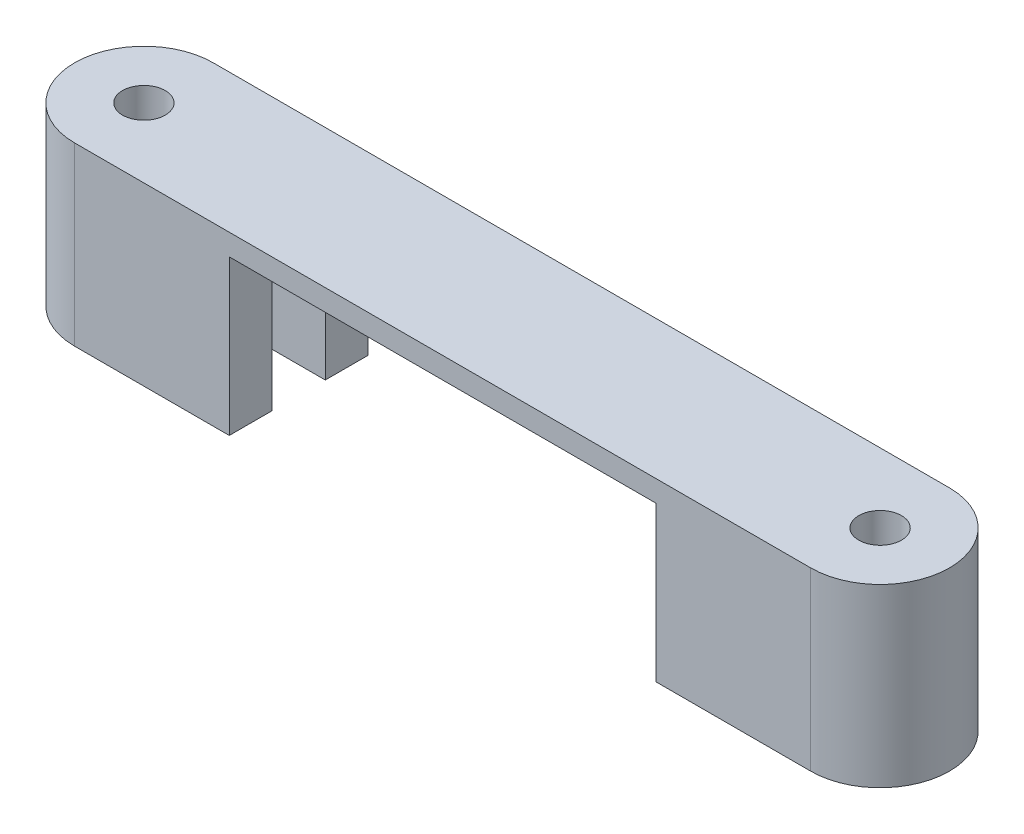
ISO-10303-21;
HEADER;
FILE_DESCRIPTION(('STEP AP214'),'2;1');
FILE_NAME('part.step','',(''),(''),'','','');
FILE_SCHEMA(('AUTOMOTIVE_DESIGN { 1 0 10303 214 1 1 1 1 }'));
ENDSEC;
DATA;
#1=APPLICATION_CONTEXT('core data for automotive mechanical design processes');
#2=APPLICATION_PROTOCOL_DEFINITION('international standard','automotive_design',2000,#1);
#3=PRODUCT_CONTEXT('',#1,'mechanical');
#4=PRODUCT('Part','Part','',(#3));
#5=PRODUCT_RELATED_PRODUCT_CATEGORY('part','',(#4));
#6=PRODUCT_DEFINITION_FORMATION('','',#4);
#7=PRODUCT_DEFINITION_CONTEXT('part definition',#1,'design');
#8=PRODUCT_DEFINITION('design','',#6,#7);
#9=PRODUCT_DEFINITION_SHAPE('','',#8);
#10=(LENGTH_UNIT() NAMED_UNIT(*) SI_UNIT(.MILLI.,.METRE.));
#11=(NAMED_UNIT(*) PLANE_ANGLE_UNIT() SI_UNIT($,.RADIAN.));
#12=(NAMED_UNIT(*) SI_UNIT($,.STERADIAN.) SOLID_ANGLE_UNIT());
#13=UNCERTAINTY_MEASURE_WITH_UNIT(LENGTH_MEASURE(1.E-05),#10,'distance_accuracy_value','');
#14=(GEOMETRIC_REPRESENTATION_CONTEXT(3) GLOBAL_UNCERTAINTY_ASSIGNED_CONTEXT((#13)) GLOBAL_UNIT_ASSIGNED_CONTEXT((#10,
#11,#12)) REPRESENTATION_CONTEXT('',''));
#15=CARTESIAN_POINT('',(0.,0.,0.));
#16=DIRECTION('',(0.,0.,1.));
#17=DIRECTION('',(1.,0.,0.));
#18=AXIS2_PLACEMENT_3D('',#15,#16,#17);
#19=CARTESIAN_POINT('',(0.,0.,-6.5));
#20=DIRECTION('',(0.,1.,0.));
#21=DIRECTION('',(0.,0.,1.));
#22=AXIS2_PLACEMENT_3D('',#19,#20,#21);
#23=PLANE('',#22);
#24=CARTESIAN_POINT('',(0.,0.,-6.5));
#25=DIRECTION('',(0.,1.,0.));
#26=DIRECTION('',(0.,0.,1.));
#27=AXIS2_PLACEMENT_3D('',#24,#25,#26);
#28=CIRCLE('',#27,2.);
#29=CARTESIAN_POINT('',(0.,0.,-4.5));
#30=VERTEX_POINT('',#29);
#31=EDGE_CURVE('E193',#30,#30,#28,.T.);
#32=ORIENTED_EDGE('',*,*,#31,.T.);
#33=EDGE_LOOP('',(#32));
#34=FACE_BOUND('',#33,.T.);
#35=DIRECTION('',(-1.,0.,0.));
#36=VECTOR('',#35,1.);
#37=CARTESIAN_POINT('',(69.,0.,-13.));
#38=LINE('',#37,#36);
#39=CARTESIAN_POINT('',(14.5,0.,-13.));
#40=VERTEX_POINT('',#39);
#41=CARTESIAN_POINT('',(0.,0.,-13.));
#42=VERTEX_POINT('',#41);
#43=EDGE_CURVE('E80',#40,#42,#38,.T.);
#44=ORIENTED_EDGE('',*,*,#43,.F.);
#45=DIRECTION('',(0.,0.,-1.));
#46=VECTOR('',#45,1.);
#47=CARTESIAN_POINT('',(14.5,0.,-8.99999999999999));
#48=LINE('',#47,#46);
#49=CARTESIAN_POINT('',(14.5,0.,-8.99999999999999));
#50=VERTEX_POINT('',#49);
#51=EDGE_CURVE('E172',#50,#40,#48,.T.);
#52=ORIENTED_EDGE('',*,*,#51,.F.);
#53=DIRECTION('',(1.,0.,0.));
#54=VECTOR('',#53,1.);
#55=CARTESIAN_POINT('',(6.49999999999999,0.,-8.99999999999999));
#56=LINE('',#55,#54);
#57=CARTESIAN_POINT('',(6.49999999999999,0.,-8.99999999999999));
#58=VERTEX_POINT('',#57);
#59=EDGE_CURVE('E275',#58,#50,#56,.T.);
#60=ORIENTED_EDGE('',*,*,#59,.F.);
#61=DIRECTION('',(0.,0.,-1.));
#62=VECTOR('',#61,1.);
#63=CARTESIAN_POINT('',(6.49999999999999,0.,-3.99999999999999));
#64=LINE('',#63,#62);
#65=CARTESIAN_POINT('',(6.49999999999999,0.,-3.99999999999999));
#66=VERTEX_POINT('',#65);
#67=EDGE_CURVE('E267',#66,#58,#64,.T.);
#68=ORIENTED_EDGE('',*,*,#67,.F.);
#69=DIRECTION('',(-1.,0.,0.));
#70=VECTOR('',#69,1.);
#71=CARTESIAN_POINT('',(14.5,0.,-3.99999999999999));
#72=LINE('',#71,#70);
#73=CARTESIAN_POINT('',(14.5,0.,-3.99999999999999));
#74=VERTEX_POINT('',#73);
#75=EDGE_CURVE('E263',#74,#66,#72,.T.);
#76=ORIENTED_EDGE('',*,*,#75,.F.);
#77=DIRECTION('',(0.,0.,-1.));
#78=VECTOR('',#77,1.);
#79=CARTESIAN_POINT('',(14.5,0.,0.));
#80=LINE('',#79,#78);
#81=CARTESIAN_POINT('',(14.5,0.,0.));
#82=VERTEX_POINT('',#81);
#83=EDGE_CURVE('E260',#82,#74,#80,.T.);
#84=ORIENTED_EDGE('',*,*,#83,.F.);
#85=DIRECTION('',(1.,0.,0.));
#86=VECTOR('',#85,1.);
#87=CARTESIAN_POINT('',(0.,0.,0.));
#88=LINE('',#87,#86);
#89=CARTESIAN_POINT('',(0.,0.,0.));
#90=VERTEX_POINT('',#89);
#91=EDGE_CURVE('E205',#90,#82,#88,.T.);
#92=ORIENTED_EDGE('',*,*,#91,.F.);
#93=CARTESIAN_POINT('',(0.,0.,-6.5));
#94=DIRECTION('',(0.,1.,0.));
#95=DIRECTION('',(0.,0.,1.));
#96=AXIS2_PLACEMENT_3D('',#93,#94,#95);
#97=CIRCLE('',#96,6.5);
#98=EDGE_CURVE('E201',#42,#90,#97,.T.);
#99=ORIENTED_EDGE('',*,*,#98,.F.);
#100=EDGE_LOOP('',(#44,#52,#60,#68,#76,#84,#92,#99));
#101=FACE_BOUND('',#100,.T.);
#102=ADVANCED_FACE('F33',(#34,#101),#23,.F.);
#103=CARTESIAN_POINT('',(0.,16.5,-6.5));
#104=DIRECTION('',(0.,-1.,0.));
#105=DIRECTION('',(0.,0.,-1.));
#106=AXIS2_PLACEMENT_3D('',#103,#104,#105);
#107=CYLINDRICAL_SURFACE('',#106,6.5);
#108=ORIENTED_EDGE('',*,*,#98,.T.);
#109=DIRECTION('',(0.,-1.,0.));
#110=VECTOR('',#109,1.);
#111=CARTESIAN_POINT('',(0.,16.5,0.));
#112=LINE('',#111,#110);
#113=CARTESIAN_POINT('',(0.,16.5,0.));
#114=VERTEX_POINT('',#113);
#115=EDGE_CURVE('E11',#114,#90,#112,.T.);
#116=ORIENTED_EDGE('',*,*,#115,.F.);
#117=CARTESIAN_POINT('',(0.,16.5,-6.5));
#118=DIRECTION('',(0.,1.,0.));
#119=DIRECTION('',(0.,0.,1.));
#120=AXIS2_PLACEMENT_3D('',#117,#118,#119);
#121=CIRCLE('',#120,6.5);
#122=CARTESIAN_POINT('',(0.,16.5,-13.));
#123=VERTEX_POINT('',#122);
#124=EDGE_CURVE('E194',#123,#114,#121,.T.);
#125=ORIENTED_EDGE('',*,*,#124,.F.);
#126=DIRECTION('',(0.,-1.,0.));
#127=VECTOR('',#126,1.);
#128=CARTESIAN_POINT('',(0.,16.5,-13.));
#129=LINE('',#128,#127);
#130=EDGE_CURVE('E200',#123,#42,#129,.T.);
#131=ORIENTED_EDGE('',*,*,#130,.T.);
#132=EDGE_LOOP('',(#108,#116,#125,#131));
#133=FACE_BOUND('',#132,.T.);
#134=ADVANCED_FACE('F35',(#133),#107,.T.);
#135=CARTESIAN_POINT('',(0.,16.5,0.));
#136=DIRECTION('',(0.,0.,-1.));
#137=DIRECTION('',(-1.,0.,0.));
#138=AXIS2_PLACEMENT_3D('',#135,#136,#137);
#139=PLANE('',#138);
#140=ORIENTED_EDGE('',*,*,#91,.T.);
#141=DIRECTION('',(0.,-1.,0.));
#142=VECTOR('',#141,1.);
#143=CARTESIAN_POINT('',(14.5,14.5,0.));
#144=LINE('',#143,#142);
#145=CARTESIAN_POINT('',(14.5,14.5,0.));
#146=VERTEX_POINT('',#145);
#147=EDGE_CURVE('E254',#146,#82,#144,.T.);
#148=ORIENTED_EDGE('',*,*,#147,.F.);
#149=DIRECTION('',(-1.,0.,0.));
#150=VECTOR('',#149,1.);
#151=CARTESIAN_POINT('',(54.5,14.5,0.));
#152=LINE('',#151,#150);
#153=CARTESIAN_POINT('',(54.5,14.5,0.));
#154=VERTEX_POINT('',#153);
#155=EDGE_CURVE('E328',#154,#146,#152,.T.);
#156=ORIENTED_EDGE('',*,*,#155,.F.);
#157=DIRECTION('',(0.,-1.,0.));
#158=VECTOR('',#157,1.);
#159=CARTESIAN_POINT('',(54.5,14.5,0.));
#160=LINE('',#159,#158);
#161=CARTESIAN_POINT('',(54.5,0.,0.));
#162=VERTEX_POINT('',#161);
#163=EDGE_CURVE('E289',#154,#162,#160,.T.);
#164=ORIENTED_EDGE('',*,*,#163,.T.);
#165=CARTESIAN_POINT('',(69.,0.,0.));
#166=VERTEX_POINT('',#165);
#167=EDGE_CURVE('E204',#162,#166,#88,.T.);
#168=ORIENTED_EDGE('',*,*,#167,.T.);
#169=DIRECTION('',(0.,-1.,0.));
#170=VECTOR('',#169,1.);
#171=CARTESIAN_POINT('',(69.,16.5,0.));
#172=LINE('',#171,#170);
#173=CARTESIAN_POINT('',(69.,16.5,0.));
#174=VERTEX_POINT('',#173);
#175=EDGE_CURVE('E42',#174,#166,#172,.T.);
#176=ORIENTED_EDGE('',*,*,#175,.F.);
#177=DIRECTION('',(1.,0.,0.));
#178=VECTOR('',#177,1.);
#179=CARTESIAN_POINT('',(0.,16.5,0.));
#180=LINE('',#179,#178);
#181=EDGE_CURVE('E87',#114,#174,#180,.T.);
#182=ORIENTED_EDGE('',*,*,#181,.F.);
#183=ORIENTED_EDGE('',*,*,#115,.T.);
#184=EDGE_LOOP('',(#140,#148,#156,#164,#168,#176,#182,#183));
#185=FACE_BOUND('',#184,.T.);
#186=ADVANCED_FACE('F241',(#185),#139,.F.);
#187=CARTESIAN_POINT('',(69.,16.5,-6.5));
#188=DIRECTION('',(0.,-1.,0.));
#189=DIRECTION('',(0.,0.,-1.));
#190=AXIS2_PLACEMENT_3D('',#187,#188,#189);
#191=CYLINDRICAL_SURFACE('',#190,6.5);
#192=CARTESIAN_POINT('',(69.,0.,-6.5));
#193=DIRECTION('',(0.,1.,0.));
#194=DIRECTION('',(0.,0.,1.));
#195=AXIS2_PLACEMENT_3D('',#192,#193,#194);
#196=CIRCLE('',#195,6.5);
#197=CARTESIAN_POINT('',(69.,0.,-13.));
#198=VERTEX_POINT('',#197);
#199=EDGE_CURVE('E208',#166,#198,#196,.T.);
#200=ORIENTED_EDGE('',*,*,#199,.T.);
#201=DIRECTION('',(0.,-1.,0.));
#202=VECTOR('',#201,1.);
#203=CARTESIAN_POINT('',(69.,16.5,-13.));
#204=LINE('',#203,#202);
#205=CARTESIAN_POINT('',(69.,16.5,-13.));
#206=VERTEX_POINT('',#205);
#207=EDGE_CURVE('E212',#206,#198,#204,.T.);
#208=ORIENTED_EDGE('',*,*,#207,.F.);
#209=CARTESIAN_POINT('',(69.,16.5,-6.5));
#210=DIRECTION('',(0.,1.,0.));
#211=DIRECTION('',(0.,0.,1.));
#212=AXIS2_PLACEMENT_3D('',#209,#210,#211);
#213=CIRCLE('',#212,6.5);
#214=EDGE_CURVE('E197',#174,#206,#213,.T.);
#215=ORIENTED_EDGE('',*,*,#214,.F.);
#216=ORIENTED_EDGE('',*,*,#175,.T.);
#217=EDGE_LOOP('',(#200,#208,#215,#216));
#218=FACE_BOUND('',#217,.T.);
#219=ADVANCED_FACE('F246',(#218),#191,.T.);
#220=CARTESIAN_POINT('',(69.,16.5,-13.));
#221=DIRECTION('',(0.,0.,1.));
#222=DIRECTION('',(1.,0.,0.));
#223=AXIS2_PLACEMENT_3D('',#220,#221,#222);
#224=PLANE('',#223);
#225=DIRECTION('',(1.,0.,0.));
#226=VECTOR('',#225,1.);
#227=CARTESIAN_POINT('',(14.5,14.5,-13.));
#228=LINE('',#227,#226);
#229=CARTESIAN_POINT('',(14.5,14.5,-13.));
#230=VERTEX_POINT('',#229);
#231=CARTESIAN_POINT('',(54.5,14.5,-13.));
#232=VERTEX_POINT('',#231);
#233=EDGE_CURVE('E164',#230,#232,#228,.T.);
#234=ORIENTED_EDGE('',*,*,#233,.F.);
#235=DIRECTION('',(0.,-1.,0.));
#236=VECTOR('',#235,1.);
#237=CARTESIAN_POINT('',(14.5,14.5,-13.));
#238=LINE('',#237,#236);
#239=EDGE_CURVE('E189',#230,#40,#238,.T.);
#240=ORIENTED_EDGE('',*,*,#239,.T.);
#241=ORIENTED_EDGE('',*,*,#43,.T.);
#242=ORIENTED_EDGE('',*,*,#130,.F.);
#243=DIRECTION('',(-1.,0.,0.));
#244=VECTOR('',#243,1.);
#245=CARTESIAN_POINT('',(69.,16.5,-13.));
#246=LINE('',#245,#244);
#247=EDGE_CURVE('E59',#206,#123,#246,.T.);
#248=ORIENTED_EDGE('',*,*,#247,.F.);
#249=ORIENTED_EDGE('',*,*,#207,.T.);
#250=CARTESIAN_POINT('',(54.5,0.,-13.));
#251=VERTEX_POINT('',#250);
#252=EDGE_CURVE('E178',#198,#251,#38,.T.);
#253=ORIENTED_EDGE('',*,*,#252,.T.);
#254=DIRECTION('',(0.,-1.,0.));
#255=VECTOR('',#254,1.);
#256=CARTESIAN_POINT('',(54.5,14.5,-13.));
#257=LINE('',#256,#255);
#258=EDGE_CURVE('E50',#232,#251,#257,.T.);
#259=ORIENTED_EDGE('',*,*,#258,.F.);
#260=EDGE_LOOP('',(#234,#240,#241,#242,#248,#249,#253,#259));
#261=FACE_BOUND('',#260,.T.);
#262=ADVANCED_FACE('F175',(#261),#224,.F.);
#263=CARTESIAN_POINT('',(0.,16.5,-6.5));
#264=DIRECTION('',(0.,1.,0.));
#265=DIRECTION('',(0.,0.,1.));
#266=AXIS2_PLACEMENT_3D('',#263,#264,#265);
#267=PLANE('',#266);
#268=CARTESIAN_POINT('',(69.,16.5,-6.5));
#269=DIRECTION('',(0.,1.,0.));
#270=DIRECTION('',(0.,0.,1.));
#271=AXIS2_PLACEMENT_3D('',#268,#269,#270);
#272=CIRCLE('',#271,2.);
#273=CARTESIAN_POINT('',(69.,16.5,-4.5));
#274=VERTEX_POINT('',#273);
#275=EDGE_CURVE('E186',#274,#274,#272,.T.);
#276=ORIENTED_EDGE('',*,*,#275,.F.);
#277=EDGE_LOOP('',(#276));
#278=FACE_BOUND('',#277,.T.);
#279=CARTESIAN_POINT('',(0.,16.5,-6.5));
#280=DIRECTION('',(0.,1.,0.));
#281=DIRECTION('',(0.,0.,1.));
#282=AXIS2_PLACEMENT_3D('',#279,#280,#281);
#283=CIRCLE('',#282,2.);
#284=CARTESIAN_POINT('',(0.,16.5,-4.5));
#285=VERTEX_POINT('',#284);
#286=EDGE_CURVE('E190',#285,#285,#283,.T.);
#287=ORIENTED_EDGE('',*,*,#286,.F.);
#288=EDGE_LOOP('',(#287));
#289=FACE_BOUND('',#288,.T.);
#290=ORIENTED_EDGE('',*,*,#124,.T.);
#291=ORIENTED_EDGE('',*,*,#181,.T.);
#292=ORIENTED_EDGE('',*,*,#214,.T.);
#293=ORIENTED_EDGE('',*,*,#247,.T.);
#294=EDGE_LOOP('',(#290,#291,#292,#293));
#295=FACE_BOUND('',#294,.T.);
#296=ADVANCED_FACE('F233',(#278,#289,#295),#267,.T.);
#297=CARTESIAN_POINT('',(69.,0.,-6.5));
#298=DIRECTION('',(0.,1.,0.));
#299=DIRECTION('',(0.,0.,1.));
#300=AXIS2_PLACEMENT_3D('',#297,#298,#299);
#301=CIRCLE('',#300,2.);
#302=CARTESIAN_POINT('',(69.,0.,-4.5));
#303=VERTEX_POINT('',#302);
#304=EDGE_CURVE('E37',#303,#303,#301,.T.);
#305=ORIENTED_EDGE('',*,*,#304,.T.);
#306=EDGE_LOOP('',(#305));
#307=FACE_BOUND('',#306,.T.);
#308=ORIENTED_EDGE('',*,*,#167,.F.);
#309=DIRECTION('',(0.,0.,1.));
#310=VECTOR('',#309,1.);
#311=CARTESIAN_POINT('',(54.5,0.,-3.99999999999999));
#312=LINE('',#311,#310);
#313=CARTESIAN_POINT('',(54.5,0.,-3.99999999999999));
#314=VERTEX_POINT('',#313);
#315=EDGE_CURVE('E265',#314,#162,#312,.T.);
#316=ORIENTED_EDGE('',*,*,#315,.F.);
#317=DIRECTION('',(-1.,0.,0.));
#318=VECTOR('',#317,1.);
#319=CARTESIAN_POINT('',(62.5,0.,-3.99999999999999));
#320=LINE('',#319,#318);
#321=CARTESIAN_POINT('',(62.5,0.,-3.99999999999999));
#322=VERTEX_POINT('',#321);
#323=EDGE_CURVE('E269',#322,#314,#320,.T.);
#324=ORIENTED_EDGE('',*,*,#323,.F.);
#325=DIRECTION('',(0.,0.,1.));
#326=VECTOR('',#325,1.);
#327=CARTESIAN_POINT('',(62.5,0.,-9.));
#328=LINE('',#327,#326);
#329=CARTESIAN_POINT('',(62.5,0.,-9.));
#330=VERTEX_POINT('',#329);
#331=EDGE_CURVE('E301',#330,#322,#328,.T.);
#332=ORIENTED_EDGE('',*,*,#331,.F.);
#333=DIRECTION('',(1.,0.,0.));
#334=VECTOR('',#333,1.);
#335=CARTESIAN_POINT('',(54.5,0.,-9.));
#336=LINE('',#335,#334);
#337=CARTESIAN_POINT('',(54.5,0.,-9.));
#338=VERTEX_POINT('',#337);
#339=EDGE_CURVE('E307',#338,#330,#336,.T.);
#340=ORIENTED_EDGE('',*,*,#339,.F.);
#341=DIRECTION('',(0.,0.,1.));
#342=VECTOR('',#341,1.);
#343=CARTESIAN_POINT('',(54.5,0.,-13.));
#344=LINE('',#343,#342);
#345=EDGE_CURVE('E310',#251,#338,#344,.T.);
#346=ORIENTED_EDGE('',*,*,#345,.F.);
#347=ORIENTED_EDGE('',*,*,#252,.F.);
#348=ORIENTED_EDGE('',*,*,#199,.F.);
#349=EDGE_LOOP('',(#308,#316,#324,#332,#340,#346,#347,#348));
#350=FACE_BOUND('',#349,.T.);
#351=ADVANCED_FACE('F223',(#307,#350),#23,.F.);
#352=CARTESIAN_POINT('',(0.,-5.50000000000001,-6.5));
#353=DIRECTION('',(0.,1.,0.));
#354=DIRECTION('',(0.,0.,1.));
#355=AXIS2_PLACEMENT_3D('',#352,#353,#354);
#356=CYLINDRICAL_SURFACE('',#355,2.);
#357=ORIENTED_EDGE('',*,*,#286,.T.);
#358=EDGE_LOOP('',(#357));
#359=FACE_BOUND('',#358,.T.);
#360=ORIENTED_EDGE('',*,*,#31,.F.);
#361=EDGE_LOOP('',(#360));
#362=FACE_BOUND('',#361,.T.);
#363=ADVANCED_FACE('F220',(#359,#362),#356,.F.);
#364=CARTESIAN_POINT('',(69.,-5.50000000000001,-6.5));
#365=DIRECTION('',(0.,1.,0.));
#366=DIRECTION('',(0.,0.,1.));
#367=AXIS2_PLACEMENT_3D('',#364,#365,#366);
#368=CYLINDRICAL_SURFACE('',#367,2.);
#369=ORIENTED_EDGE('',*,*,#275,.T.);
#370=EDGE_LOOP('',(#369));
#371=FACE_BOUND('',#370,.T.);
#372=ORIENTED_EDGE('',*,*,#304,.F.);
#373=EDGE_LOOP('',(#372));
#374=FACE_BOUND('',#373,.T.);
#375=ADVANCED_FACE('F222',(#371,#374),#368,.F.);
#376=CARTESIAN_POINT('',(14.5,14.5,-8.99999999999999));
#377=DIRECTION('',(-1.,0.,0.));
#378=DIRECTION('',(0.,0.,1.));
#379=AXIS2_PLACEMENT_3D('',#376,#377,#378);
#380=PLANE('',#379);
#381=ORIENTED_EDGE('',*,*,#51,.T.);
#382=ORIENTED_EDGE('',*,*,#239,.F.);
#383=DIRECTION('',(0.,0.,-1.));
#384=VECTOR('',#383,1.);
#385=CARTESIAN_POINT('',(14.5,14.5,-8.99999999999999));
#386=LINE('',#385,#384);
#387=CARTESIAN_POINT('',(14.5,14.5,-8.99999999999999));
#388=VERTEX_POINT('',#387);
#389=EDGE_CURVE('E171',#388,#230,#386,.T.);
#390=ORIENTED_EDGE('',*,*,#389,.F.);
#391=DIRECTION('',(0.,-1.,0.));
#392=VECTOR('',#391,1.);
#393=CARTESIAN_POINT('',(14.5,14.5,-8.99999999999999));
#394=LINE('',#393,#392);
#395=EDGE_CURVE('E280',#388,#50,#394,.T.);
#396=ORIENTED_EDGE('',*,*,#395,.T.);
#397=EDGE_LOOP('',(#381,#382,#390,#396));
#398=FACE_BOUND('',#397,.T.);
#399=ADVANCED_FACE('F230',(#398),#380,.F.);
#400=CARTESIAN_POINT('',(6.49999999999999,14.5,-8.99999999999999));
#401=DIRECTION('',(0.,0.,-1.));
#402=DIRECTION('',(-1.,0.,0.));
#403=AXIS2_PLACEMENT_3D('',#400,#401,#402);
#404=PLANE('',#403);
#405=ORIENTED_EDGE('',*,*,#59,.T.);
#406=ORIENTED_EDGE('',*,*,#395,.F.);
#407=DIRECTION('',(1.,0.,0.));
#408=VECTOR('',#407,1.);
#409=CARTESIAN_POINT('',(6.49999999999999,14.5,-8.99999999999999));
#410=LINE('',#409,#408);
#411=CARTESIAN_POINT('',(6.49999999999999,14.5,-8.99999999999999));
#412=VERTEX_POINT('',#411);
#413=EDGE_CURVE('E182',#412,#388,#410,.T.);
#414=ORIENTED_EDGE('',*,*,#413,.F.);
#415=DIRECTION('',(0.,-1.,0.));
#416=VECTOR('',#415,1.);
#417=CARTESIAN_POINT('',(6.49999999999999,14.5,-8.99999999999999));
#418=LINE('',#417,#416);
#419=EDGE_CURVE('E282',#412,#58,#418,.T.);
#420=ORIENTED_EDGE('',*,*,#419,.T.);
#421=EDGE_LOOP('',(#405,#406,#414,#420));
#422=FACE_BOUND('',#421,.T.);
#423=ADVANCED_FACE('F377',(#422),#404,.F.);
#424=CARTESIAN_POINT('',(6.49999999999999,14.5,-3.99999999999999));
#425=DIRECTION('',(-1.,0.,0.));
#426=DIRECTION('',(0.,0.,1.));
#427=AXIS2_PLACEMENT_3D('',#424,#425,#426);
#428=PLANE('',#427);
#429=ORIENTED_EDGE('',*,*,#67,.T.);
#430=ORIENTED_EDGE('',*,*,#419,.F.);
#431=DIRECTION('',(0.,0.,-1.));
#432=VECTOR('',#431,1.);
#433=CARTESIAN_POINT('',(6.49999999999999,14.5,-3.99999999999999));
#434=LINE('',#433,#432);
#435=CARTESIAN_POINT('',(6.49999999999999,14.5,-3.99999999999999));
#436=VERTEX_POINT('',#435);
#437=EDGE_CURVE('E319',#436,#412,#434,.T.);
#438=ORIENTED_EDGE('',*,*,#437,.F.);
#439=DIRECTION('',(0.,-1.,0.));
#440=VECTOR('',#439,1.);
#441=CARTESIAN_POINT('',(6.49999999999999,14.5,-3.99999999999999));
#442=LINE('',#441,#440);
#443=EDGE_CURVE('E284',#436,#66,#442,.T.);
#444=ORIENTED_EDGE('',*,*,#443,.T.);
#445=EDGE_LOOP('',(#429,#430,#438,#444));
#446=FACE_BOUND('',#445,.T.);
#447=ADVANCED_FACE('F388',(#446),#428,.F.);
#448=CARTESIAN_POINT('',(14.5,14.5,-3.99999999999999));
#449=DIRECTION('',(0.,0.,1.));
#450=DIRECTION('',(1.,0.,0.));
#451=AXIS2_PLACEMENT_3D('',#448,#449,#450);
#452=PLANE('',#451);
#453=ORIENTED_EDGE('',*,*,#75,.T.);
#454=ORIENTED_EDGE('',*,*,#443,.F.);
#455=DIRECTION('',(-1.,0.,0.));
#456=VECTOR('',#455,1.);
#457=CARTESIAN_POINT('',(14.5,14.5,-3.99999999999999));
#458=LINE('',#457,#456);
#459=CARTESIAN_POINT('',(14.5,14.5,-3.99999999999999));
#460=VERTEX_POINT('',#459);
#461=EDGE_CURVE('E322',#460,#436,#458,.T.);
#462=ORIENTED_EDGE('',*,*,#461,.F.);
#463=DIRECTION('',(0.,-1.,0.));
#464=VECTOR('',#463,1.);
#465=CARTESIAN_POINT('',(14.5,14.5,-3.99999999999999));
#466=LINE('',#465,#464);
#467=EDGE_CURVE('E286',#460,#74,#466,.T.);
#468=ORIENTED_EDGE('',*,*,#467,.T.);
#469=EDGE_LOOP('',(#453,#454,#462,#468));
#470=FACE_BOUND('',#469,.T.);
#471=ADVANCED_FACE('F398',(#470),#452,.F.);
#472=CARTESIAN_POINT('',(14.5,14.5,0.));
#473=DIRECTION('',(-1.,0.,0.));
#474=DIRECTION('',(0.,0.,1.));
#475=AXIS2_PLACEMENT_3D('',#472,#473,#474);
#476=PLANE('',#475);
#477=ORIENTED_EDGE('',*,*,#83,.T.);
#478=ORIENTED_EDGE('',*,*,#467,.F.);
#479=DIRECTION('',(0.,0.,-1.));
#480=VECTOR('',#479,1.);
#481=CARTESIAN_POINT('',(14.5,14.5,0.));
#482=LINE('',#481,#480);
#483=EDGE_CURVE('E325',#146,#460,#482,.T.);
#484=ORIENTED_EDGE('',*,*,#483,.F.);
#485=ORIENTED_EDGE('',*,*,#147,.T.);
#486=EDGE_LOOP('',(#477,#478,#484,#485));
#487=FACE_BOUND('',#486,.T.);
#488=ADVANCED_FACE('F408',(#487),#476,.F.);
#489=CARTESIAN_POINT('',(54.5,14.5,-3.99999999999999));
#490=DIRECTION('',(1.,0.,0.));
#491=DIRECTION('',(0.,0.,-1.));
#492=AXIS2_PLACEMENT_3D('',#489,#490,#491);
#493=PLANE('',#492);
#494=ORIENTED_EDGE('',*,*,#315,.T.);
#495=ORIENTED_EDGE('',*,*,#163,.F.);
#496=DIRECTION('',(0.,0.,1.));
#497=VECTOR('',#496,1.);
#498=CARTESIAN_POINT('',(54.5,14.5,-3.99999999999999));
#499=LINE('',#498,#497);
#500=CARTESIAN_POINT('',(54.5,14.5,-3.99999999999999));
#501=VERTEX_POINT('',#500);
#502=EDGE_CURVE('E331',#501,#154,#499,.T.);
#503=ORIENTED_EDGE('',*,*,#502,.F.);
#504=DIRECTION('',(0.,-1.,0.));
#505=VECTOR('',#504,1.);
#506=CARTESIAN_POINT('',(54.5,14.5,-3.99999999999999));
#507=LINE('',#506,#505);
#508=EDGE_CURVE('E292',#501,#314,#507,.T.);
#509=ORIENTED_EDGE('',*,*,#508,.T.);
#510=EDGE_LOOP('',(#494,#495,#503,#509));
#511=FACE_BOUND('',#510,.T.);
#512=ADVANCED_FACE('F343',(#511),#493,.F.);
#513=CARTESIAN_POINT('',(62.5,14.5,-3.99999999999999));
#514=DIRECTION('',(0.,0.,1.));
#515=DIRECTION('',(1.,0.,0.));
#516=AXIS2_PLACEMENT_3D('',#513,#514,#515);
#517=PLANE('',#516);
#518=ORIENTED_EDGE('',*,*,#323,.T.);
#519=ORIENTED_EDGE('',*,*,#508,.F.);
#520=DIRECTION('',(-1.,0.,0.));
#521=VECTOR('',#520,1.);
#522=CARTESIAN_POINT('',(62.5,14.5,-3.99999999999999));
#523=LINE('',#522,#521);
#524=CARTESIAN_POINT('',(62.5,14.5,-3.99999999999999));
#525=VERTEX_POINT('',#524);
#526=EDGE_CURVE('E334',#525,#501,#523,.T.);
#527=ORIENTED_EDGE('',*,*,#526,.F.);
#528=DIRECTION('',(0.,-1.,0.));
#529=VECTOR('',#528,1.);
#530=CARTESIAN_POINT('',(62.5,14.5,-3.99999999999999));
#531=LINE('',#530,#529);
#532=EDGE_CURVE('E294',#525,#322,#531,.T.);
#533=ORIENTED_EDGE('',*,*,#532,.T.);
#534=EDGE_LOOP('',(#518,#519,#527,#533));
#535=FACE_BOUND('',#534,.T.);
#536=ADVANCED_FACE('F341',(#535),#517,.F.);
#537=CARTESIAN_POINT('',(62.5,14.5,-9.));
#538=DIRECTION('',(1.,0.,0.));
#539=DIRECTION('',(0.,0.,-1.));
#540=AXIS2_PLACEMENT_3D('',#537,#538,#539);
#541=PLANE('',#540);
#542=ORIENTED_EDGE('',*,*,#331,.T.);
#543=ORIENTED_EDGE('',*,*,#532,.F.);
#544=DIRECTION('',(0.,0.,1.));
#545=VECTOR('',#544,1.);
#546=CARTESIAN_POINT('',(62.5,14.5,-9.));
#547=LINE('',#546,#545);
#548=CARTESIAN_POINT('',(62.5,14.5,-9.));
#549=VERTEX_POINT('',#548);
#550=EDGE_CURVE('E304',#549,#525,#547,.T.);
#551=ORIENTED_EDGE('',*,*,#550,.F.);
#552=DIRECTION('',(0.,-1.,0.));
#553=VECTOR('',#552,1.);
#554=CARTESIAN_POINT('',(62.5,14.5,-9.));
#555=LINE('',#554,#553);
#556=EDGE_CURVE('E180',#549,#330,#555,.T.);
#557=ORIENTED_EDGE('',*,*,#556,.T.);
#558=EDGE_LOOP('',(#542,#543,#551,#557));
#559=FACE_BOUND('',#558,.T.);
#560=ADVANCED_FACE('F299',(#559),#541,.F.);
#561=CARTESIAN_POINT('',(54.5,14.5,-9.));
#562=DIRECTION('',(0.,0.,-1.));
#563=DIRECTION('',(-1.,0.,0.));
#564=AXIS2_PLACEMENT_3D('',#561,#562,#563);
#565=PLANE('',#564);
#566=ORIENTED_EDGE('',*,*,#339,.T.);
#567=ORIENTED_EDGE('',*,*,#556,.F.);
#568=DIRECTION('',(1.,0.,0.));
#569=VECTOR('',#568,1.);
#570=CARTESIAN_POINT('',(54.5,14.5,-9.));
#571=LINE('',#570,#569);
#572=CARTESIAN_POINT('',(54.5,14.5,-9.));
#573=VERTEX_POINT('',#572);
#574=EDGE_CURVE('E163',#573,#549,#571,.T.);
#575=ORIENTED_EDGE('',*,*,#574,.F.);
#576=DIRECTION('',(0.,-1.,0.));
#577=VECTOR('',#576,1.);
#578=CARTESIAN_POINT('',(54.5,14.5,-9.));
#579=LINE('',#578,#577);
#580=EDGE_CURVE('E159',#573,#338,#579,.T.);
#581=ORIENTED_EDGE('',*,*,#580,.T.);
#582=EDGE_LOOP('',(#566,#567,#575,#581));
#583=FACE_BOUND('',#582,.T.);
#584=ADVANCED_FACE('F308',(#583),#565,.F.);
#585=CARTESIAN_POINT('',(54.5,14.5,-13.));
#586=DIRECTION('',(1.,0.,0.));
#587=DIRECTION('',(0.,0.,-1.));
#588=AXIS2_PLACEMENT_3D('',#585,#586,#587);
#589=PLANE('',#588);
#590=ORIENTED_EDGE('',*,*,#345,.T.);
#591=ORIENTED_EDGE('',*,*,#580,.F.);
#592=DIRECTION('',(0.,0.,1.));
#593=VECTOR('',#592,1.);
#594=CARTESIAN_POINT('',(54.5,14.5,-13.));
#595=LINE('',#594,#593);
#596=EDGE_CURVE('E156',#232,#573,#595,.T.);
#597=ORIENTED_EDGE('',*,*,#596,.F.);
#598=ORIENTED_EDGE('',*,*,#258,.T.);
#599=EDGE_LOOP('',(#590,#591,#597,#598));
#600=FACE_BOUND('',#599,.T.);
#601=ADVANCED_FACE('F158',(#600),#589,.F.);
#602=CARTESIAN_POINT('',(0.,14.5,0.));
#603=DIRECTION('',(0.,-1.,0.));
#604=DIRECTION('',(0.,0.,-1.));
#605=AXIS2_PLACEMENT_3D('',#602,#603,#604);
#606=PLANE('',#605);
#607=ORIENTED_EDGE('',*,*,#233,.T.);
#608=ORIENTED_EDGE('',*,*,#596,.T.);
#609=ORIENTED_EDGE('',*,*,#574,.T.);
#610=ORIENTED_EDGE('',*,*,#550,.T.);
#611=ORIENTED_EDGE('',*,*,#526,.T.);
#612=ORIENTED_EDGE('',*,*,#502,.T.);
#613=ORIENTED_EDGE('',*,*,#155,.T.);
#614=ORIENTED_EDGE('',*,*,#483,.T.);
#615=ORIENTED_EDGE('',*,*,#461,.T.);
#616=ORIENTED_EDGE('',*,*,#437,.T.);
#617=ORIENTED_EDGE('',*,*,#413,.T.);
#618=ORIENTED_EDGE('',*,*,#389,.T.);
#619=EDGE_LOOP('',(#607,#608,#609,#610,#611,#612,#613,#614,#615,#616,#617,#618));
#620=FACE_BOUND('',#619,.T.);
#621=ADVANCED_FACE('F168',(#620),#606,.T.);
#622=CLOSED_SHELL('',(#102,#134,#186,#219,#262,#296,#351,#363,#375,#399,#423,#447,#471,#488,
#512,#536,#560,#584,#601,#621));
#623=MANIFOLD_SOLID_BREP('B2',#622);
#624=ADVANCED_BREP_SHAPE_REPRESENTATION('',(#18,#623),#14);
#625=SHAPE_DEFINITION_REPRESENTATION(#9,#624);
ENDSEC;
END-ISO-10303-21;
